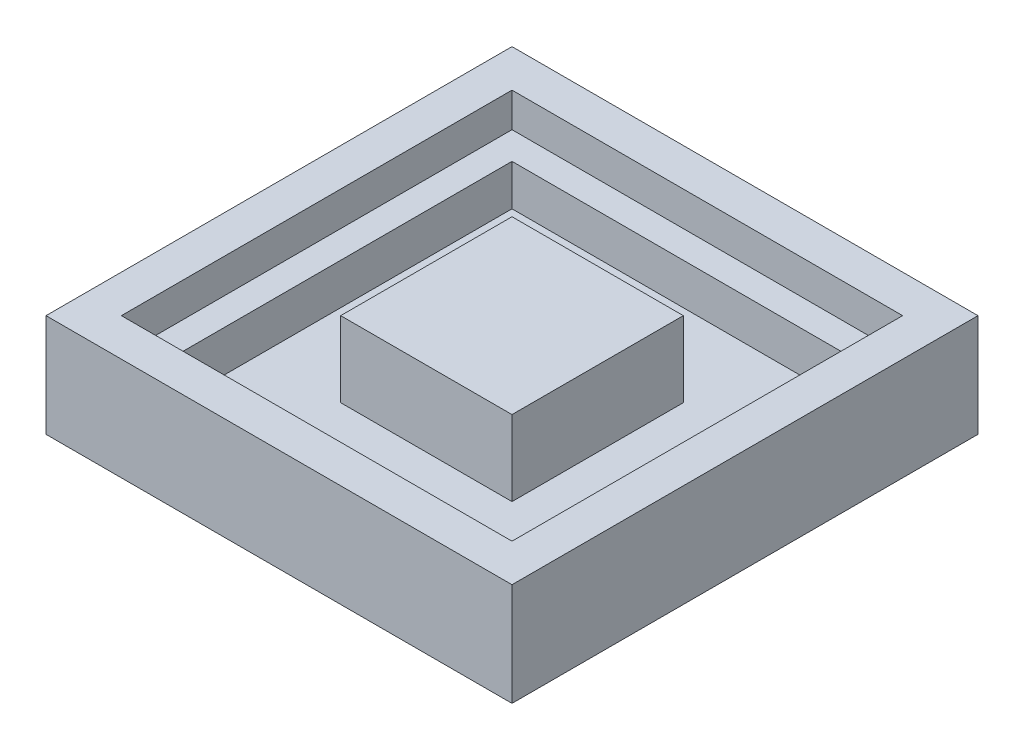
ISO-10303-21;
HEADER;
FILE_DESCRIPTION(('STEP AP214'),'2;1');
FILE_NAME('part.step','',(''),(''),'','','');
FILE_SCHEMA(('AUTOMOTIVE_DESIGN { 1 0 10303 214 1 1 1 1 }'));
ENDSEC;
DATA;
#1=APPLICATION_CONTEXT('core data for automotive mechanical design processes');
#2=APPLICATION_PROTOCOL_DEFINITION('international standard','automotive_design',2000,#1);
#3=PRODUCT_CONTEXT('',#1,'mechanical');
#4=PRODUCT('Part','Part','',(#3));
#5=PRODUCT_RELATED_PRODUCT_CATEGORY('part','',(#4));
#6=PRODUCT_DEFINITION_FORMATION('','',#4);
#7=PRODUCT_DEFINITION_CONTEXT('part definition',#1,'design');
#8=PRODUCT_DEFINITION('design','',#6,#7);
#9=PRODUCT_DEFINITION_SHAPE('','',#8);
#10=(LENGTH_UNIT() NAMED_UNIT(*) SI_UNIT(.MILLI.,.METRE.));
#11=(NAMED_UNIT(*) PLANE_ANGLE_UNIT() SI_UNIT($,.RADIAN.));
#12=(NAMED_UNIT(*) SI_UNIT($,.STERADIAN.) SOLID_ANGLE_UNIT());
#13=UNCERTAINTY_MEASURE_WITH_UNIT(LENGTH_MEASURE(1.E-05),#10,'distance_accuracy_value','');
#14=(GEOMETRIC_REPRESENTATION_CONTEXT(3) GLOBAL_UNCERTAINTY_ASSIGNED_CONTEXT((#13)) GLOBAL_UNIT_ASSIGNED_CONTEXT((#10,
#11,#12)) REPRESENTATION_CONTEXT('',''));
#15=CARTESIAN_POINT('',(0.,0.,0.));
#16=DIRECTION('',(0.,0.,1.));
#17=DIRECTION('',(1.,0.,0.));
#18=AXIS2_PLACEMENT_3D('',#15,#16,#17);
#19=CARTESIAN_POINT('',(2.74999999999999,5.,-2.75));
#20=DIRECTION('',(0.,0.,1.));
#21=DIRECTION('',(1.,0.,0.));
#22=AXIS2_PLACEMENT_3D('',#19,#20,#21);
#23=PLANE('',#22);
#24=DIRECTION('',(-1.,0.,0.));
#25=VECTOR('',#24,1.);
#26=CARTESIAN_POINT('',(0.,7.5,-2.75));
#27=LINE('',#26,#25);
#28=CARTESIAN_POINT('',(31.25,7.5,-2.75000000000001));
#29=VERTEX_POINT('',#28);
#30=CARTESIAN_POINT('',(2.74999999999999,7.5,-2.75));
#31=VERTEX_POINT('',#30);
#32=EDGE_CURVE('E226',#29,#31,#27,.T.);
#33=ORIENTED_EDGE('',*,*,#32,.F.);
#34=DIRECTION('',(0.,1.,0.));
#35=VECTOR('',#34,1.);
#36=CARTESIAN_POINT('',(31.25,5.,-2.75000000000001));
#37=LINE('',#36,#35);
#38=CARTESIAN_POINT('',(31.25,5.,-2.75000000000001));
#39=VERTEX_POINT('',#38);
#40=EDGE_CURVE('E270',#39,#29,#37,.T.);
#41=ORIENTED_EDGE('',*,*,#40,.F.);
#42=DIRECTION('',(1.,0.,0.));
#43=VECTOR('',#42,1.);
#44=CARTESIAN_POINT('',(2.74999999999999,5.,-2.75));
#45=LINE('',#44,#43);
#46=CARTESIAN_POINT('',(2.74999999999999,5.,-2.75));
#47=VERTEX_POINT('',#46);
#48=EDGE_CURVE('E258',#47,#39,#45,.T.);
#49=ORIENTED_EDGE('',*,*,#48,.F.);
#50=DIRECTION('',(0.,1.,0.));
#51=VECTOR('',#50,1.);
#52=CARTESIAN_POINT('',(2.74999999999999,5.,-2.75));
#53=LINE('',#52,#51);
#54=EDGE_CURVE('E271',#47,#31,#53,.T.);
#55=ORIENTED_EDGE('',*,*,#54,.T.);
#56=EDGE_LOOP('',(#33,#41,#49,#55));
#57=FACE_BOUND('',#56,.T.);
#58=ADVANCED_FACE('F61',(#57),#23,.F.);
#59=CARTESIAN_POINT('',(2.74999999999999,5.,-2.75));
#60=DIRECTION('',(-1.,0.,0.));
#61=DIRECTION('',(0.,0.,1.));
#62=AXIS2_PLACEMENT_3D('',#59,#60,#61);
#63=PLANE('',#62);
#64=DIRECTION('',(0.,0.,-1.));
#65=VECTOR('',#64,1.);
#66=CARTESIAN_POINT('',(2.74999999999999,7.5,0.));
#67=LINE('',#66,#65);
#68=CARTESIAN_POINT('',(2.74999999999999,7.5,-31.25));
#69=VERTEX_POINT('',#68);
#70=EDGE_CURVE('E228',#31,#69,#67,.T.);
#71=ORIENTED_EDGE('',*,*,#70,.F.);
#72=ORIENTED_EDGE('',*,*,#54,.F.);
#73=DIRECTION('',(0.,0.,1.));
#74=VECTOR('',#73,1.);
#75=CARTESIAN_POINT('',(2.74999999999999,5.,-2.75));
#76=LINE('',#75,#74);
#77=CARTESIAN_POINT('',(2.74999999999999,5.,-31.25));
#78=VERTEX_POINT('',#77);
#79=EDGE_CURVE('E267',#78,#47,#76,.T.);
#80=ORIENTED_EDGE('',*,*,#79,.F.);
#81=DIRECTION('',(0.,1.,0.));
#82=VECTOR('',#81,1.);
#83=CARTESIAN_POINT('',(2.74999999999999,5.,-31.25));
#84=LINE('',#83,#82);
#85=EDGE_CURVE('E275',#78,#69,#84,.T.);
#86=ORIENTED_EDGE('',*,*,#85,.T.);
#87=EDGE_LOOP('',(#71,#72,#80,#86));
#88=FACE_BOUND('',#87,.T.);
#89=ADVANCED_FACE('F359',(#88),#63,.F.);
#90=CARTESIAN_POINT('',(2.74999999999999,5.,-31.25));
#91=DIRECTION('',(0.,0.,-1.));
#92=DIRECTION('',(-1.,0.,0.));
#93=AXIS2_PLACEMENT_3D('',#90,#91,#92);
#94=PLANE('',#93);
#95=DIRECTION('',(1.,0.,0.));
#96=VECTOR('',#95,1.);
#97=CARTESIAN_POINT('',(0.,7.5,-31.25));
#98=LINE('',#97,#96);
#99=CARTESIAN_POINT('',(31.25,7.5,-31.25));
#100=VERTEX_POINT('',#99);
#101=EDGE_CURVE('E84',#69,#100,#98,.T.);
#102=ORIENTED_EDGE('',*,*,#101,.F.);
#103=ORIENTED_EDGE('',*,*,#85,.F.);
#104=DIRECTION('',(-1.,0.,0.));
#105=VECTOR('',#104,1.);
#106=CARTESIAN_POINT('',(2.74999999999999,5.,-31.25));
#107=LINE('',#106,#105);
#108=CARTESIAN_POINT('',(31.25,5.,-31.25));
#109=VERTEX_POINT('',#108);
#110=EDGE_CURVE('E264',#109,#78,#107,.T.);
#111=ORIENTED_EDGE('',*,*,#110,.F.);
#112=DIRECTION('',(0.,1.,0.));
#113=VECTOR('',#112,1.);
#114=CARTESIAN_POINT('',(31.25,5.,-31.25));
#115=LINE('',#114,#113);
#116=EDGE_CURVE('E278',#109,#100,#115,.T.);
#117=ORIENTED_EDGE('',*,*,#116,.T.);
#118=EDGE_LOOP('',(#102,#103,#111,#117));
#119=FACE_BOUND('',#118,.T.);
#120=ADVANCED_FACE('F365',(#119),#94,.F.);
#121=CARTESIAN_POINT('',(31.25,5.,-2.75000000000001));
#122=DIRECTION('',(1.,0.,0.));
#123=DIRECTION('',(0.,0.,-1.));
#124=AXIS2_PLACEMENT_3D('',#121,#122,#123);
#125=PLANE('',#124);
#126=DIRECTION('',(0.,0.,1.));
#127=VECTOR('',#126,1.);
#128=CARTESIAN_POINT('',(31.25,7.5,0.));
#129=LINE('',#128,#127);
#130=EDGE_CURVE('E221',#100,#29,#129,.T.);
#131=ORIENTED_EDGE('',*,*,#130,.F.);
#132=ORIENTED_EDGE('',*,*,#116,.F.);
#133=DIRECTION('',(0.,0.,-1.));
#134=VECTOR('',#133,1.);
#135=CARTESIAN_POINT('',(31.25,5.,-2.75000000000001));
#136=LINE('',#135,#134);
#137=EDGE_CURVE('E261',#39,#109,#136,.T.);
#138=ORIENTED_EDGE('',*,*,#137,.F.);
#139=ORIENTED_EDGE('',*,*,#40,.T.);
#140=EDGE_LOOP('',(#131,#132,#138,#139));
#141=FACE_BOUND('',#140,.T.);
#142=ADVANCED_FACE('F370',(#141),#125,.F.);
#143=CARTESIAN_POINT('',(10.75,25.6776695296637,-23.25));
#144=DIRECTION('',(0.,0.,1.));
#145=DIRECTION('',(1.,0.,0.));
#146=AXIS2_PLACEMENT_3D('',#143,#144,#145);
#147=PLANE('',#146);
#148=DIRECTION('',(-1.,0.,0.));
#149=VECTOR('',#148,1.);
#150=CARTESIAN_POINT('',(0.,7.5,-23.25));
#151=LINE('',#150,#149);
#152=CARTESIAN_POINT('',(23.25,7.5,-23.25));
#153=VERTEX_POINT('',#152);
#154=CARTESIAN_POINT('',(10.75,7.5,-23.25));
#155=VERTEX_POINT('',#154);
#156=EDGE_CURVE('E230',#153,#155,#151,.T.);
#157=ORIENTED_EDGE('',*,*,#156,.F.);
#158=DIRECTION('',(0.,-1.,0.));
#159=VECTOR('',#158,1.);
#160=CARTESIAN_POINT('',(23.25,25.6776695296637,-23.25));
#161=LINE('',#160,#159);
#162=CARTESIAN_POINT('',(23.25,2.,-23.25));
#163=VERTEX_POINT('',#162);
#164=EDGE_CURVE('E252',#153,#163,#161,.T.);
#165=ORIENTED_EDGE('',*,*,#164,.T.);
#166=DIRECTION('',(-1.,0.,0.));
#167=VECTOR('',#166,1.);
#168=CARTESIAN_POINT('',(10.75,2.,-23.25));
#169=LINE('',#168,#167);
#170=CARTESIAN_POINT('',(10.75,2.,-23.25));
#171=VERTEX_POINT('',#170);
#172=EDGE_CURVE('E247',#163,#171,#169,.T.);
#173=ORIENTED_EDGE('',*,*,#172,.T.);
#174=DIRECTION('',(0.,-1.,0.));
#175=VECTOR('',#174,1.);
#176=CARTESIAN_POINT('',(10.75,25.6776695296637,-23.25));
#177=LINE('',#176,#175);
#178=EDGE_CURVE('E250',#155,#171,#177,.T.);
#179=ORIENTED_EDGE('',*,*,#178,.F.);
#180=EDGE_LOOP('',(#157,#165,#173,#179));
#181=FACE_BOUND('',#180,.T.);
#182=ADVANCED_FACE('F338',(#181),#147,.F.);
#183=CARTESIAN_POINT('',(23.25,25.6776695296637,-23.25));
#184=DIRECTION('',(-1.,0.,0.));
#185=DIRECTION('',(0.,0.,1.));
#186=AXIS2_PLACEMENT_3D('',#183,#184,#185);
#187=PLANE('',#186);
#188=DIRECTION('',(0.,0.,-1.));
#189=VECTOR('',#188,1.);
#190=CARTESIAN_POINT('',(23.25,7.5,0.));
#191=LINE('',#190,#189);
#192=CARTESIAN_POINT('',(23.25,7.5,-10.75));
#193=VERTEX_POINT('',#192);
#194=EDGE_CURVE('E236',#193,#153,#191,.T.);
#195=ORIENTED_EDGE('',*,*,#194,.F.);
#196=DIRECTION('',(0.,-1.,0.));
#197=VECTOR('',#196,1.);
#198=CARTESIAN_POINT('',(23.25,25.6776695296637,-10.75));
#199=LINE('',#198,#197);
#200=CARTESIAN_POINT('',(23.25,2.,-10.75));
#201=VERTEX_POINT('',#200);
#202=EDGE_CURVE('E254',#193,#201,#199,.T.);
#203=ORIENTED_EDGE('',*,*,#202,.T.);
#204=DIRECTION('',(0.,0.,-1.));
#205=VECTOR('',#204,1.);
#206=CARTESIAN_POINT('',(23.25,2.,-23.25));
#207=LINE('',#206,#205);
#208=EDGE_CURVE('E244',#201,#163,#207,.T.);
#209=ORIENTED_EDGE('',*,*,#208,.T.);
#210=ORIENTED_EDGE('',*,*,#164,.F.);
#211=EDGE_LOOP('',(#195,#203,#209,#210));
#212=FACE_BOUND('',#211,.T.);
#213=ADVANCED_FACE('F342',(#212),#187,.F.);
#214=CARTESIAN_POINT('',(10.75,25.6776695296637,-10.75));
#215=DIRECTION('',(0.,0.,-1.));
#216=DIRECTION('',(-1.,0.,0.));
#217=AXIS2_PLACEMENT_3D('',#214,#215,#216);
#218=PLANE('',#217);
#219=DIRECTION('',(1.,0.,0.));
#220=VECTOR('',#219,1.);
#221=CARTESIAN_POINT('',(0.,7.5,-10.75));
#222=LINE('',#221,#220);
#223=CARTESIAN_POINT('',(10.75,7.5,-10.75));
#224=VERTEX_POINT('',#223);
#225=EDGE_CURVE('E234',#224,#193,#222,.T.);
#226=ORIENTED_EDGE('',*,*,#225,.F.);
#227=DIRECTION('',(0.,-1.,0.));
#228=VECTOR('',#227,1.);
#229=CARTESIAN_POINT('',(10.75,25.6776695296637,-10.75));
#230=LINE('',#229,#228);
#231=CARTESIAN_POINT('',(10.75,2.,-10.75));
#232=VERTEX_POINT('',#231);
#233=EDGE_CURVE('E256',#224,#232,#230,.T.);
#234=ORIENTED_EDGE('',*,*,#233,.T.);
#235=DIRECTION('',(1.,0.,0.));
#236=VECTOR('',#235,1.);
#237=CARTESIAN_POINT('',(10.75,2.,-10.75));
#238=LINE('',#237,#236);
#239=EDGE_CURVE('E241',#232,#201,#238,.T.);
#240=ORIENTED_EDGE('',*,*,#239,.T.);
#241=ORIENTED_EDGE('',*,*,#202,.F.);
#242=EDGE_LOOP('',(#226,#234,#240,#241));
#243=FACE_BOUND('',#242,.T.);
#244=ADVANCED_FACE('F346',(#243),#218,.F.);
#245=CARTESIAN_POINT('',(10.75,25.6776695296637,-23.25));
#246=DIRECTION('',(1.,0.,0.));
#247=DIRECTION('',(0.,0.,-1.));
#248=AXIS2_PLACEMENT_3D('',#245,#246,#247);
#249=PLANE('',#248);
#250=DIRECTION('',(0.,0.,1.));
#251=VECTOR('',#250,1.);
#252=CARTESIAN_POINT('',(10.75,7.5,0.));
#253=LINE('',#252,#251);
#254=EDGE_CURVE('E232',#155,#224,#253,.T.);
#255=ORIENTED_EDGE('',*,*,#254,.F.);
#256=ORIENTED_EDGE('',*,*,#178,.T.);
#257=DIRECTION('',(0.,0.,1.));
#258=VECTOR('',#257,1.);
#259=CARTESIAN_POINT('',(10.75,2.,-23.25));
#260=LINE('',#259,#258);
#261=EDGE_CURVE('E238',#171,#232,#260,.T.);
#262=ORIENTED_EDGE('',*,*,#261,.T.);
#263=ORIENTED_EDGE('',*,*,#233,.F.);
#264=EDGE_LOOP('',(#255,#256,#262,#263));
#265=FACE_BOUND('',#264,.T.);
#266=ADVANCED_FACE('F326',(#265),#249,.F.);
#267=CARTESIAN_POINT('',(0.,2.,0.));
#268=DIRECTION('',(0.,1.,0.));
#269=DIRECTION('',(0.,0.,1.));
#270=AXIS2_PLACEMENT_3D('',#267,#268,#269);
#271=PLANE('',#270);
#272=DIRECTION('',(1.,0.,0.));
#273=VECTOR('',#272,1.);
#274=CARTESIAN_POINT('',(4.74999999999999,2.,-4.75));
#275=LINE('',#274,#273);
#276=CARTESIAN_POINT('',(4.74999999999999,2.,-4.75));
#277=VERTEX_POINT('',#276);
#278=CARTESIAN_POINT('',(29.25,2.,-4.75));
#279=VERTEX_POINT('',#278);
#280=EDGE_CURVE('E288',#277,#279,#275,.T.);
#281=ORIENTED_EDGE('',*,*,#280,.T.);
#282=DIRECTION('',(0.,0.,-1.));
#283=VECTOR('',#282,1.);
#284=CARTESIAN_POINT('',(29.25,2.,-4.75));
#285=LINE('',#284,#283);
#286=CARTESIAN_POINT('',(29.25,2.,-29.25));
#287=VERTEX_POINT('',#286);
#288=EDGE_CURVE('E291',#279,#287,#285,.T.);
#289=ORIENTED_EDGE('',*,*,#288,.T.);
#290=DIRECTION('',(-1.,0.,0.));
#291=VECTOR('',#290,1.);
#292=CARTESIAN_POINT('',(4.74999999999999,2.,-29.25));
#293=LINE('',#292,#291);
#294=CARTESIAN_POINT('',(4.74999999999999,2.,-29.25));
#295=VERTEX_POINT('',#294);
#296=EDGE_CURVE('E294',#287,#295,#293,.T.);
#297=ORIENTED_EDGE('',*,*,#296,.T.);
#298=DIRECTION('',(0.,0.,1.));
#299=VECTOR('',#298,1.);
#300=CARTESIAN_POINT('',(4.74999999999999,2.,-4.75));
#301=LINE('',#300,#299);
#302=EDGE_CURVE('E297',#295,#277,#301,.T.);
#303=ORIENTED_EDGE('',*,*,#302,.T.);
#304=EDGE_LOOP('',(#281,#289,#297,#303));
#305=FACE_BOUND('',#304,.T.);
#306=ORIENTED_EDGE('',*,*,#261,.F.);
#307=ORIENTED_EDGE('',*,*,#172,.F.);
#308=ORIENTED_EDGE('',*,*,#208,.F.);
#309=ORIENTED_EDGE('',*,*,#239,.F.);
#310=EDGE_LOOP('',(#306,#307,#308,#309));
#311=FACE_BOUND('',#310,.T.);
#312=ADVANCED_FACE('F323',(#305,#311),#271,.T.);
#313=CARTESIAN_POINT('',(0.,5.,0.));
#314=DIRECTION('',(0.,1.,0.));
#315=DIRECTION('',(0.,0.,1.));
#316=AXIS2_PLACEMENT_3D('',#313,#314,#315);
#317=PLANE('',#316);
#318=ORIENTED_EDGE('',*,*,#48,.T.);
#319=ORIENTED_EDGE('',*,*,#137,.T.);
#320=ORIENTED_EDGE('',*,*,#110,.T.);
#321=ORIENTED_EDGE('',*,*,#79,.T.);
#322=EDGE_LOOP('',(#318,#319,#320,#321));
#323=FACE_BOUND('',#322,.T.);
#324=DIRECTION('',(-1.,0.,0.));
#325=VECTOR('',#324,1.);
#326=CARTESIAN_POINT('',(4.74999999999999,5.,-4.75));
#327=LINE('',#326,#325);
#328=CARTESIAN_POINT('',(29.25,5.,-4.75));
#329=VERTEX_POINT('',#328);
#330=CARTESIAN_POINT('',(4.74999999999999,5.,-4.75));
#331=VERTEX_POINT('',#330);
#332=EDGE_CURVE('E286',#329,#331,#327,.T.);
#333=ORIENTED_EDGE('',*,*,#332,.T.);
#334=DIRECTION('',(0.,0.,-1.));
#335=VECTOR('',#334,1.);
#336=CARTESIAN_POINT('',(4.74999999999999,5.,-4.75));
#337=LINE('',#336,#335);
#338=CARTESIAN_POINT('',(4.74999999999999,5.,-29.25));
#339=VERTEX_POINT('',#338);
#340=EDGE_CURVE('E284',#331,#339,#337,.T.);
#341=ORIENTED_EDGE('',*,*,#340,.T.);
#342=DIRECTION('',(1.,0.,0.));
#343=VECTOR('',#342,1.);
#344=CARTESIAN_POINT('',(4.74999999999999,5.,-29.25));
#345=LINE('',#344,#343);
#346=CARTESIAN_POINT('',(29.25,5.,-29.25));
#347=VERTEX_POINT('',#346);
#348=EDGE_CURVE('E274',#339,#347,#345,.T.);
#349=ORIENTED_EDGE('',*,*,#348,.T.);
#350=DIRECTION('',(0.,0.,1.));
#351=VECTOR('',#350,1.);
#352=CARTESIAN_POINT('',(29.25,5.,-4.75));
#353=LINE('',#352,#351);
#354=EDGE_CURVE('E12',#347,#329,#353,.T.);
#355=ORIENTED_EDGE('',*,*,#354,.T.);
#356=EDGE_LOOP('',(#333,#341,#349,#355));
#357=FACE_BOUND('',#356,.T.);
#358=ADVANCED_FACE('F317',(#323,#357),#317,.T.);
#359=CARTESIAN_POINT('',(29.25,2.,-4.75));
#360=DIRECTION('',(1.,0.,0.));
#361=DIRECTION('',(0.,0.,-1.));
#362=AXIS2_PLACEMENT_3D('',#359,#360,#361);
#363=PLANE('',#362);
#364=ORIENTED_EDGE('',*,*,#354,.F.);
#365=DIRECTION('',(0.,1.,0.));
#366=VECTOR('',#365,1.);
#367=CARTESIAN_POINT('',(29.25,2.,-29.25));
#368=LINE('',#367,#366);
#369=EDGE_CURVE('E301',#287,#347,#368,.T.);
#370=ORIENTED_EDGE('',*,*,#369,.F.);
#371=ORIENTED_EDGE('',*,*,#288,.F.);
#372=DIRECTION('',(0.,1.,0.));
#373=VECTOR('',#372,1.);
#374=CARTESIAN_POINT('',(29.25,2.,-4.75));
#375=LINE('',#374,#373);
#376=EDGE_CURVE('E216',#279,#329,#375,.T.);
#377=ORIENTED_EDGE('',*,*,#376,.T.);
#378=EDGE_LOOP('',(#364,#370,#371,#377));
#379=FACE_BOUND('',#378,.T.);
#380=ADVANCED_FACE('F310',(#379),#363,.F.);
#381=CARTESIAN_POINT('',(4.74999999999999,2.,-29.25));
#382=DIRECTION('',(0.,0.,-1.));
#383=DIRECTION('',(-1.,0.,0.));
#384=AXIS2_PLACEMENT_3D('',#381,#382,#383);
#385=PLANE('',#384);
#386=ORIENTED_EDGE('',*,*,#348,.F.);
#387=DIRECTION('',(0.,1.,0.));
#388=VECTOR('',#387,1.);
#389=CARTESIAN_POINT('',(4.74999999999999,2.,-29.25));
#390=LINE('',#389,#388);
#391=EDGE_CURVE('E213',#295,#339,#390,.T.);
#392=ORIENTED_EDGE('',*,*,#391,.F.);
#393=ORIENTED_EDGE('',*,*,#296,.F.);
#394=ORIENTED_EDGE('',*,*,#369,.T.);
#395=EDGE_LOOP('',(#386,#392,#393,#394));
#396=FACE_BOUND('',#395,.T.);
#397=ADVANCED_FACE('F321',(#396),#385,.F.);
#398=CARTESIAN_POINT('',(4.74999999999999,2.,-4.75));
#399=DIRECTION('',(-1.,0.,0.));
#400=DIRECTION('',(0.,0.,1.));
#401=AXIS2_PLACEMENT_3D('',#398,#399,#400);
#402=PLANE('',#401);
#403=ORIENTED_EDGE('',*,*,#340,.F.);
#404=DIRECTION('',(0.,1.,0.));
#405=VECTOR('',#404,1.);
#406=CARTESIAN_POINT('',(4.74999999999999,2.,-4.75));
#407=LINE('',#406,#405);
#408=EDGE_CURVE('E210',#277,#331,#407,.T.);
#409=ORIENTED_EDGE('',*,*,#408,.F.);
#410=ORIENTED_EDGE('',*,*,#302,.F.);
#411=ORIENTED_EDGE('',*,*,#391,.T.);
#412=EDGE_LOOP('',(#403,#409,#410,#411));
#413=FACE_BOUND('',#412,.T.);
#414=ADVANCED_FACE('F319',(#413),#402,.F.);
#415=CARTESIAN_POINT('',(4.74999999999999,2.,-4.75));
#416=DIRECTION('',(0.,0.,1.));
#417=DIRECTION('',(1.,0.,0.));
#418=AXIS2_PLACEMENT_3D('',#415,#416,#417);
#419=PLANE('',#418);
#420=ORIENTED_EDGE('',*,*,#332,.F.);
#421=ORIENTED_EDGE('',*,*,#376,.F.);
#422=ORIENTED_EDGE('',*,*,#280,.F.);
#423=ORIENTED_EDGE('',*,*,#408,.T.);
#424=EDGE_LOOP('',(#420,#421,#422,#423));
#425=FACE_BOUND('',#424,.T.);
#426=ADVANCED_FACE('F314',(#425),#419,.F.);
#427=CARTESIAN_POINT('',(0.,7.5,0.));
#428=DIRECTION('',(0.,1.,0.));
#429=DIRECTION('',(0.,0.,1.));
#430=AXIS2_PLACEMENT_3D('',#427,#428,#429);
#431=PLANE('',#430);
#432=ORIENTED_EDGE('',*,*,#156,.T.);
#433=ORIENTED_EDGE('',*,*,#254,.T.);
#434=ORIENTED_EDGE('',*,*,#225,.T.);
#435=ORIENTED_EDGE('',*,*,#194,.T.);
#436=EDGE_LOOP('',(#432,#433,#434,#435));
#437=FACE_BOUND('',#436,.T.);
#438=ADVANCED_FACE('F348',(#437),#431,.T.);
#439=CARTESIAN_POINT('',(0.,7.5,0.));
#440=DIRECTION('',(0.,1.,0.));
#441=DIRECTION('',(0.,0.,1.));
#442=AXIS2_PLACEMENT_3D('',#439,#440,#441);
#443=PLANE('',#442);
#444=DIRECTION('',(-1.,0.,0.));
#445=VECTOR('',#444,1.);
#446=CARTESIAN_POINT('',(0.,7.5,-34.));
#447=LINE('',#446,#445);
#448=CARTESIAN_POINT('',(34.,7.5,-34.));
#449=VERTEX_POINT('',#448);
#450=CARTESIAN_POINT('',(0.,7.5,-34.));
#451=VERTEX_POINT('',#450);
#452=EDGE_CURVE('E170',#449,#451,#447,.T.);
#453=ORIENTED_EDGE('',*,*,#452,.T.);
#454=DIRECTION('',(0.,0.,1.));
#455=VECTOR('',#454,1.);
#456=CARTESIAN_POINT('',(0.,7.5,0.));
#457=LINE('',#456,#455);
#458=CARTESIAN_POINT('',(0.,7.5,0.));
#459=VERTEX_POINT('',#458);
#460=EDGE_CURVE('E173',#451,#459,#457,.T.);
#461=ORIENTED_EDGE('',*,*,#460,.T.);
#462=DIRECTION('',(1.,0.,0.));
#463=VECTOR('',#462,1.);
#464=CARTESIAN_POINT('',(0.,7.5,0.));
#465=LINE('',#464,#463);
#466=CARTESIAN_POINT('',(34.,7.5,0.));
#467=VERTEX_POINT('',#466);
#468=EDGE_CURVE('E184',#459,#467,#465,.T.);
#469=ORIENTED_EDGE('',*,*,#468,.T.);
#470=DIRECTION('',(0.,0.,-1.));
#471=VECTOR('',#470,1.);
#472=CARTESIAN_POINT('',(34.,7.5,0.));
#473=LINE('',#472,#471);
#474=EDGE_CURVE('E76',#467,#449,#473,.T.);
#475=ORIENTED_EDGE('',*,*,#474,.T.);
#476=EDGE_LOOP('',(#453,#461,#469,#475));
#477=FACE_BOUND('',#476,.T.);
#478=ORIENTED_EDGE('',*,*,#101,.T.);
#479=ORIENTED_EDGE('',*,*,#130,.T.);
#480=ORIENTED_EDGE('',*,*,#32,.T.);
#481=ORIENTED_EDGE('',*,*,#70,.T.);
#482=EDGE_LOOP('',(#478,#479,#480,#481));
#483=FACE_BOUND('',#482,.T.);
#484=ADVANCED_FACE('F172',(#477,#483),#443,.T.);
#485=CARTESIAN_POINT('',(0.,0.,0.));
#486=DIRECTION('',(0.,-1.,0.));
#487=DIRECTION('',(0.,0.,-1.));
#488=AXIS2_PLACEMENT_3D('',#485,#486,#487);
#489=PLANE('',#488);
#490=DIRECTION('',(0.,0.,1.));
#491=VECTOR('',#490,1.);
#492=CARTESIAN_POINT('',(0.,0.,0.));
#493=LINE('',#492,#491);
#494=CARTESIAN_POINT('',(0.,0.,-34.));
#495=VERTEX_POINT('',#494);
#496=CARTESIAN_POINT('',(0.,0.,0.));
#497=VERTEX_POINT('',#496);
#498=EDGE_CURVE('E207',#495,#497,#493,.T.);
#499=ORIENTED_EDGE('',*,*,#498,.F.);
#500=DIRECTION('',(-1.,0.,0.));
#501=VECTOR('',#500,1.);
#502=CARTESIAN_POINT('',(0.,0.,-34.));
#503=LINE('',#502,#501);
#504=CARTESIAN_POINT('',(34.,0.,-34.));
#505=VERTEX_POINT('',#504);
#506=EDGE_CURVE('E188',#505,#495,#503,.T.);
#507=ORIENTED_EDGE('',*,*,#506,.F.);
#508=DIRECTION('',(0.,0.,-1.));
#509=VECTOR('',#508,1.);
#510=CARTESIAN_POINT('',(34.,0.,0.));
#511=LINE('',#510,#509);
#512=CARTESIAN_POINT('',(34.,0.,0.));
#513=VERTEX_POINT('',#512);
#514=EDGE_CURVE('E194',#513,#505,#511,.T.);
#515=ORIENTED_EDGE('',*,*,#514,.F.);
#516=DIRECTION('',(1.,0.,0.));
#517=VECTOR('',#516,1.);
#518=CARTESIAN_POINT('',(0.,0.,0.));
#519=LINE('',#518,#517);
#520=EDGE_CURVE('E203',#497,#513,#519,.T.);
#521=ORIENTED_EDGE('',*,*,#520,.F.);
#522=EDGE_LOOP('',(#499,#507,#515,#521));
#523=FACE_BOUND('',#522,.T.);
#524=ADVANCED_FACE('F206',(#523),#489,.T.);
#525=CARTESIAN_POINT('',(0.,8.,-34.));
#526=DIRECTION('',(0.,0.,1.));
#527=DIRECTION('',(1.,0.,0.));
#528=AXIS2_PLACEMENT_3D('',#525,#526,#527);
#529=PLANE('',#528);
#530=ORIENTED_EDGE('',*,*,#452,.F.);
#531=DIRECTION('',(0.,-1.,0.));
#532=VECTOR('',#531,1.);
#533=CARTESIAN_POINT('',(34.,8.,-34.));
#534=LINE('',#533,#532);
#535=EDGE_CURVE('E190',#449,#505,#534,.T.);
#536=ORIENTED_EDGE('',*,*,#535,.T.);
#537=ORIENTED_EDGE('',*,*,#506,.T.);
#538=DIRECTION('',(0.,-1.,0.));
#539=VECTOR('',#538,1.);
#540=CARTESIAN_POINT('',(0.,8.,-34.));
#541=LINE('',#540,#539);
#542=EDGE_CURVE('E182',#451,#495,#541,.T.);
#543=ORIENTED_EDGE('',*,*,#542,.F.);
#544=EDGE_LOOP('',(#530,#536,#537,#543));
#545=FACE_BOUND('',#544,.T.);
#546=ADVANCED_FACE('F186',(#545),#529,.F.);
#547=CARTESIAN_POINT('',(34.,8.,0.));
#548=DIRECTION('',(-1.,0.,0.));
#549=DIRECTION('',(0.,0.,1.));
#550=AXIS2_PLACEMENT_3D('',#547,#548,#549);
#551=PLANE('',#550);
#552=ORIENTED_EDGE('',*,*,#474,.F.);
#553=DIRECTION('',(0.,-1.,0.));
#554=VECTOR('',#553,1.);
#555=CARTESIAN_POINT('',(34.,8.,0.));
#556=LINE('',#555,#554);
#557=EDGE_CURVE('E192',#467,#513,#556,.T.);
#558=ORIENTED_EDGE('',*,*,#557,.T.);
#559=ORIENTED_EDGE('',*,*,#514,.T.);
#560=ORIENTED_EDGE('',*,*,#535,.F.);
#561=EDGE_LOOP('',(#552,#558,#559,#560));
#562=FACE_BOUND('',#561,.T.);
#563=ADVANCED_FACE('F219',(#562),#551,.F.);
#564=CARTESIAN_POINT('',(0.,8.,0.));
#565=DIRECTION('',(0.,0.,-1.));
#566=DIRECTION('',(-1.,0.,0.));
#567=AXIS2_PLACEMENT_3D('',#564,#565,#566);
#568=PLANE('',#567);
#569=ORIENTED_EDGE('',*,*,#468,.F.);
#570=DIRECTION('',(0.,-1.,0.));
#571=VECTOR('',#570,1.);
#572=CARTESIAN_POINT('',(0.,8.,0.));
#573=LINE('',#572,#571);
#574=EDGE_CURVE('E69',#459,#497,#573,.T.);
#575=ORIENTED_EDGE('',*,*,#574,.T.);
#576=ORIENTED_EDGE('',*,*,#520,.T.);
#577=ORIENTED_EDGE('',*,*,#557,.F.);
#578=EDGE_LOOP('',(#569,#575,#576,#577));
#579=FACE_BOUND('',#578,.T.);
#580=ADVANCED_FACE('F201',(#579),#568,.F.);
#581=CARTESIAN_POINT('',(0.,8.,0.));
#582=DIRECTION('',(1.,0.,0.));
#583=DIRECTION('',(0.,0.,-1.));
#584=AXIS2_PLACEMENT_3D('',#581,#582,#583);
#585=PLANE('',#584);
#586=ORIENTED_EDGE('',*,*,#460,.F.);
#587=ORIENTED_EDGE('',*,*,#542,.T.);
#588=ORIENTED_EDGE('',*,*,#498,.T.);
#589=ORIENTED_EDGE('',*,*,#574,.F.);
#590=EDGE_LOOP('',(#586,#587,#588,#589));
#591=FACE_BOUND('',#590,.T.);
#592=ADVANCED_FACE('F63',(#591),#585,.F.);
#593=CLOSED_SHELL('',(#58,#89,#120,#142,#182,#213,#244,#266,#312,#358,#380,#397,#414,#426,#438,
#484,#524,#546,#563,#580,#592));
#594=MANIFOLD_SOLID_BREP('B2',#593);
#595=ADVANCED_BREP_SHAPE_REPRESENTATION('',(#18,#594),#14);
#596=SHAPE_DEFINITION_REPRESENTATION(#9,#595);
ENDSEC;
END-ISO-10303-21;
